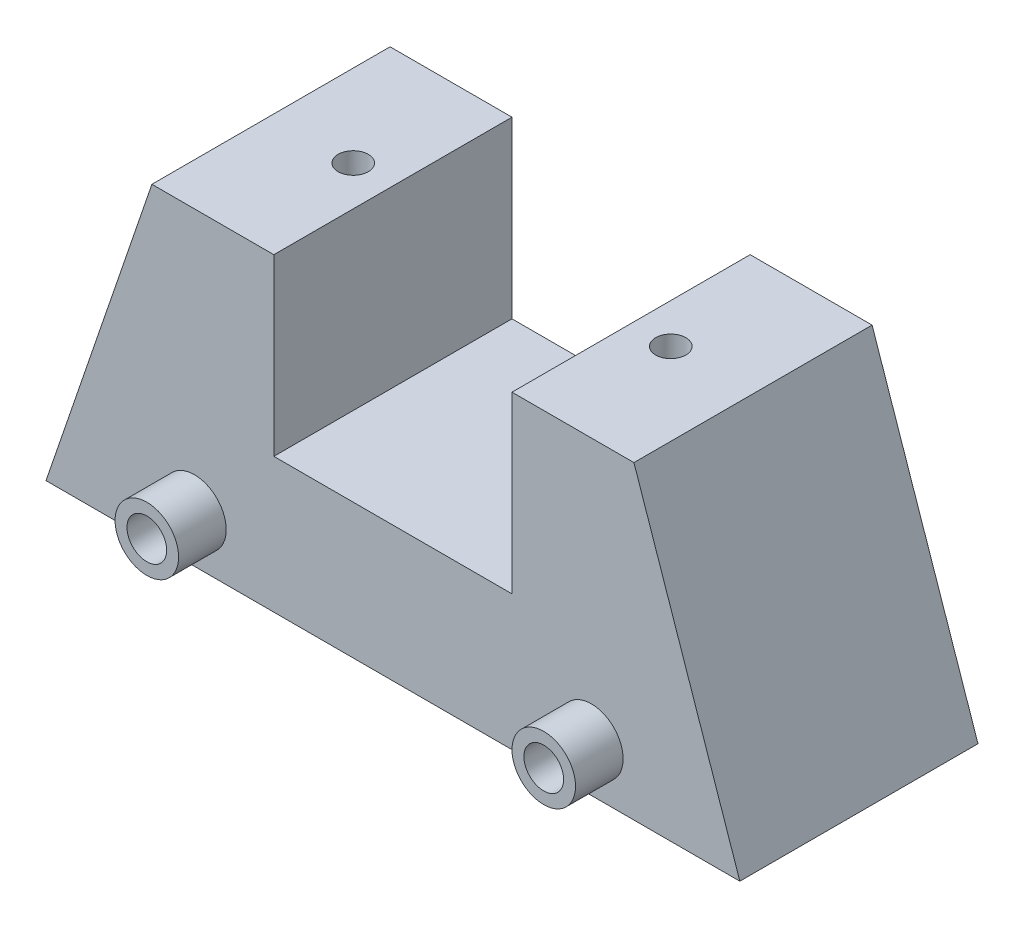
ISO-10303-21;
HEADER;
FILE_DESCRIPTION(('STEP AP214'),'2;1');
FILE_NAME('part.step','',(''),(''),'','','');
FILE_SCHEMA(('AUTOMOTIVE_DESIGN { 1 0 10303 214 1 1 1 1 }'));
ENDSEC;
DATA;
#1=APPLICATION_CONTEXT('core data for automotive mechanical design processes');
#2=APPLICATION_PROTOCOL_DEFINITION('international standard','automotive_design',2000,#1);
#3=PRODUCT_CONTEXT('',#1,'mechanical');
#4=PRODUCT('Part','Part','',(#3));
#5=PRODUCT_RELATED_PRODUCT_CATEGORY('part','',(#4));
#6=PRODUCT_DEFINITION_FORMATION('','',#4);
#7=PRODUCT_DEFINITION_CONTEXT('part definition',#1,'design');
#8=PRODUCT_DEFINITION('design','',#6,#7);
#9=PRODUCT_DEFINITION_SHAPE('','',#8);
#10=(LENGTH_UNIT() NAMED_UNIT(*) SI_UNIT(.MILLI.,.METRE.));
#11=(NAMED_UNIT(*) PLANE_ANGLE_UNIT() SI_UNIT($,.RADIAN.));
#12=(NAMED_UNIT(*) SI_UNIT($,.STERADIAN.) SOLID_ANGLE_UNIT());
#13=UNCERTAINTY_MEASURE_WITH_UNIT(LENGTH_MEASURE(1.E-05),#10,'distance_accuracy_value','');
#14=(GEOMETRIC_REPRESENTATION_CONTEXT(3) GLOBAL_UNCERTAINTY_ASSIGNED_CONTEXT((#13)) GLOBAL_UNIT_ASSIGNED_CONTEXT((#10,
#11,#12)) REPRESENTATION_CONTEXT('',''));
#15=CARTESIAN_POINT('',(0.,0.,0.));
#16=DIRECTION('',(0.,0.,1.));
#17=DIRECTION('',(1.,0.,0.));
#18=AXIS2_PLACEMENT_3D('',#15,#16,#17);
#19=CARTESIAN_POINT('',(-43.7,39.,30.));
#20=DIRECTION('',(0.,-1.,0.));
#21=DIRECTION('',(1.,0.,0.));
#22=AXIS2_PLACEMENT_3D('',#19,#20,#21);
#23=PLANE('',#22);
#24=CARTESIAN_POINT('',(20.,39.,15.));
#25=DIRECTION('',(0.,1.,0.));
#26=DIRECTION('',(-1.,0.,0.));
#27=AXIS2_PLACEMENT_3D('',#24,#25,#26);
#28=CIRCLE('',#27,1.9);
#29=CARTESIAN_POINT('',(18.1,39.,15.));
#30=VERTEX_POINT('',#29);
#31=EDGE_CURVE('E298',#30,#30,#28,.T.);
#32=ORIENTED_EDGE('',*,*,#31,.F.);
#33=EDGE_LOOP('',(#32));
#34=FACE_BOUND('',#33,.T.);
#35=DIRECTION('',(-1.,0.,0.));
#36=VECTOR('',#35,1.);
#37=CARTESIAN_POINT('',(-43.7,39.,0.));
#38=LINE('',#37,#36);
#39=CARTESIAN_POINT('',(30.3587215046538,39.,0.));
#40=VERTEX_POINT('',#39);
#41=CARTESIAN_POINT('',(15.,39.,0.));
#42=VERTEX_POINT('',#41);
#43=EDGE_CURVE('E176',#40,#42,#38,.T.);
#44=ORIENTED_EDGE('',*,*,#43,.T.);
#45=DIRECTION('',(0.,0.,1.));
#46=VECTOR('',#45,1.);
#47=CARTESIAN_POINT('',(15.,39.,0.));
#48=LINE('',#47,#46);
#49=CARTESIAN_POINT('',(15.,39.,30.));
#50=VERTEX_POINT('',#49);
#51=EDGE_CURVE('E271',#42,#50,#48,.T.);
#52=ORIENTED_EDGE('',*,*,#51,.T.);
#53=DIRECTION('',(-1.,0.,0.));
#54=VECTOR('',#53,1.);
#55=CARTESIAN_POINT('',(-43.7,39.,30.));
#56=LINE('',#55,#54);
#57=CARTESIAN_POINT('',(30.3587215046538,39.,30.));
#58=VERTEX_POINT('',#57);
#59=EDGE_CURVE('E172',#58,#50,#56,.T.);
#60=ORIENTED_EDGE('',*,*,#59,.F.);
#61=DIRECTION('',(0.,0.,1.));
#62=VECTOR('',#61,1.);
#63=CARTESIAN_POINT('',(30.3587215046538,39.,0.));
#64=LINE('',#63,#62);
#65=EDGE_CURVE('E251',#40,#58,#64,.T.);
#66=ORIENTED_EDGE('',*,*,#65,.F.);
#67=EDGE_LOOP('',(#44,#52,#60,#66));
#68=FACE_BOUND('',#67,.T.);
#69=ADVANCED_FACE('F39',(#34,#68),#23,.F.);
#70=CARTESIAN_POINT('',(-43.7,0.,30.));
#71=DIRECTION('',(0.,1.,0.));
#72=DIRECTION('',(-1.,0.,0.));
#73=AXIS2_PLACEMENT_3D('',#70,#71,#72);
#74=PLANE('',#73);
#75=DIRECTION('',(1.,0.,0.));
#76=VECTOR('',#75,1.);
#77=CARTESIAN_POINT('',(-43.7,0.,0.));
#78=LINE('',#77,#76);
#79=CARTESIAN_POINT('',(-43.7,0.,0.));
#80=VERTEX_POINT('',#79);
#81=CARTESIAN_POINT('',(43.7,0.,0.));
#82=VERTEX_POINT('',#81);
#83=EDGE_CURVE('E152',#80,#82,#78,.T.);
#84=ORIENTED_EDGE('',*,*,#83,.T.);
#85=DIRECTION('',(0.,0.,-1.));
#86=VECTOR('',#85,1.);
#87=CARTESIAN_POINT('',(43.7,0.,30.));
#88=LINE('',#87,#86);
#89=CARTESIAN_POINT('',(43.7,0.,30.));
#90=VERTEX_POINT('',#89);
#91=EDGE_CURVE('E167',#90,#82,#88,.T.);
#92=ORIENTED_EDGE('',*,*,#91,.F.);
#93=DIRECTION('',(1.,0.,0.));
#94=VECTOR('',#93,1.);
#95=CARTESIAN_POINT('',(-43.7,0.,30.));
#96=LINE('',#95,#94);
#97=CARTESIAN_POINT('',(-43.7,0.,30.));
#98=VERTEX_POINT('',#97);
#99=EDGE_CURVE('E165',#98,#90,#96,.T.);
#100=ORIENTED_EDGE('',*,*,#99,.F.);
#101=DIRECTION('',(0.,0.,-1.));
#102=VECTOR('',#101,1.);
#103=CARTESIAN_POINT('',(-43.7,0.,30.));
#104=LINE('',#103,#102);
#105=EDGE_CURVE('E142',#98,#80,#104,.T.);
#106=ORIENTED_EDGE('',*,*,#105,.T.);
#107=EDGE_LOOP('',(#84,#92,#100,#106));
#108=FACE_BOUND('',#107,.T.);
#109=DIRECTION('',(1.,0.,0.));
#110=VECTOR('',#109,1.);
#111=CARTESIAN_POINT('',(-38.6679002644307,0.,4.));
#112=LINE('',#111,#110);
#113=CARTESIAN_POINT('',(-38.6679002644307,0.,4.));
#114=VERTEX_POINT('',#113);
#115=CARTESIAN_POINT('',(38.6679002644307,0.,4.));
#116=VERTEX_POINT('',#115);
#117=EDGE_CURVE('E244',#114,#116,#112,.T.);
#118=ORIENTED_EDGE('',*,*,#117,.F.);
#119=DIRECTION('',(0.,0.,1.));
#120=VECTOR('',#119,1.);
#121=CARTESIAN_POINT('',(-38.6679002644307,0.,4.));
#122=LINE('',#121,#120);
#123=CARTESIAN_POINT('',(-38.6679002644307,0.,26.));
#124=VERTEX_POINT('',#123);
#125=EDGE_CURVE('E184',#114,#124,#122,.T.);
#126=ORIENTED_EDGE('',*,*,#125,.T.);
#127=DIRECTION('',(1.,0.,0.));
#128=VECTOR('',#127,1.);
#129=CARTESIAN_POINT('',(-38.6679002644307,0.,26.));
#130=LINE('',#129,#128);
#131=CARTESIAN_POINT('',(38.6679002644307,0.,26.));
#132=VERTEX_POINT('',#131);
#133=EDGE_CURVE('E221',#124,#132,#130,.T.);
#134=ORIENTED_EDGE('',*,*,#133,.T.);
#135=DIRECTION('',(0.,0.,1.));
#136=VECTOR('',#135,1.);
#137=CARTESIAN_POINT('',(38.6679002644307,0.,4.));
#138=LINE('',#137,#136);
#139=EDGE_CURVE('E188',#116,#132,#138,.T.);
#140=ORIENTED_EDGE('',*,*,#139,.F.);
#141=EDGE_LOOP('',(#118,#126,#134,#140));
#142=FACE_BOUND('',#141,.T.);
#143=ADVANCED_FACE('F41',(#108,#142),#74,.F.);
#144=CARTESIAN_POINT('',(-20.,39.,15.));
#145=DIRECTION('',(0.,1.,0.));
#146=DIRECTION('',(-1.,0.,0.));
#147=AXIS2_PLACEMENT_3D('',#144,#145,#146);
#148=CIRCLE('',#147,1.9);
#149=CARTESIAN_POINT('',(-21.9,39.,15.));
#150=VERTEX_POINT('',#149);
#151=EDGE_CURVE('E307',#150,#150,#148,.T.);
#152=ORIENTED_EDGE('',*,*,#151,.F.);
#153=EDGE_LOOP('',(#152));
#154=FACE_BOUND('',#153,.T.);
#155=CARTESIAN_POINT('',(-15.,39.,0.));
#156=VERTEX_POINT('',#155);
#157=CARTESIAN_POINT('',(-30.3587215046538,39.,0.));
#158=VERTEX_POINT('',#157);
#159=EDGE_CURVE('E159',#156,#158,#38,.T.);
#160=ORIENTED_EDGE('',*,*,#159,.T.);
#161=DIRECTION('',(0.,0.,1.));
#162=VECTOR('',#161,1.);
#163=CARTESIAN_POINT('',(-30.3587215046538,39.,0.));
#164=LINE('',#163,#162);
#165=CARTESIAN_POINT('',(-30.3587215046538,39.,30.));
#166=VERTEX_POINT('',#165);
#167=EDGE_CURVE('E63',#158,#166,#164,.T.);
#168=ORIENTED_EDGE('',*,*,#167,.T.);
#169=CARTESIAN_POINT('',(-15.,39.,30.));
#170=VERTEX_POINT('',#169);
#171=EDGE_CURVE('E178',#170,#166,#56,.T.);
#172=ORIENTED_EDGE('',*,*,#171,.F.);
#173=DIRECTION('',(0.,0.,1.));
#174=VECTOR('',#173,1.);
#175=CARTESIAN_POINT('',(-15.,39.,0.));
#176=LINE('',#175,#174);
#177=EDGE_CURVE('E261',#156,#170,#176,.T.);
#178=ORIENTED_EDGE('',*,*,#177,.F.);
#179=EDGE_LOOP('',(#160,#168,#172,#178));
#180=FACE_BOUND('',#179,.T.);
#181=ADVANCED_FACE('F357',(#154,#180),#23,.F.);
#182=CARTESIAN_POINT('',(0.,0.,30.));
#183=DIRECTION('',(0.,0.,-1.));
#184=DIRECTION('',(-1.,0.,0.));
#185=AXIS2_PLACEMENT_3D('',#182,#183,#184);
#186=PLANE('',#185);
#187=CARTESIAN_POINT('',(-25.,6.,30.));
#188=DIRECTION('',(0.,0.,-1.));
#189=DIRECTION('',(-1.,0.,0.));
#190=AXIS2_PLACEMENT_3D('',#187,#188,#189);
#191=CIRCLE('',#190,4.);
#192=CARTESIAN_POINT('',(-29.,6.,30.));
#193=VERTEX_POINT('',#192);
#194=EDGE_CURVE('E11',#193,#193,#191,.F.);
#195=ORIENTED_EDGE('',*,*,#194,.F.);
#196=EDGE_LOOP('',(#195));
#197=FACE_BOUND('',#196,.T.);
#198=CARTESIAN_POINT('',(25.,6.,30.));
#199=DIRECTION('',(0.,0.,-1.));
#200=DIRECTION('',(-1.,0.,0.));
#201=AXIS2_PLACEMENT_3D('',#198,#199,#200);
#202=CIRCLE('',#201,4.);
#203=CARTESIAN_POINT('',(21.,6.,30.));
#204=VERTEX_POINT('',#203);
#205=EDGE_CURVE('E48',#204,#204,#202,.F.);
#206=ORIENTED_EDGE('',*,*,#205,.F.);
#207=EDGE_LOOP('',(#206));
#208=FACE_BOUND('',#207,.T.);
#209=ORIENTED_EDGE('',*,*,#171,.T.);
#210=DIRECTION('',(0.323669722532752,0.946170127786526,0.));
#211=VECTOR('',#210,1.);
#212=CARTESIAN_POINT('',(-43.7,0.,30.));
#213=LINE('',#212,#211);
#214=EDGE_CURVE('E148',#98,#166,#213,.T.);
#215=ORIENTED_EDGE('',*,*,#214,.F.);
#216=ORIENTED_EDGE('',*,*,#99,.T.);
#217=DIRECTION('',(0.323669722532752,-0.946170127786526,0.));
#218=VECTOR('',#217,1.);
#219=CARTESIAN_POINT('',(30.3587215046538,39.,30.));
#220=LINE('',#219,#218);
#221=EDGE_CURVE('E255',#58,#90,#220,.T.);
#222=ORIENTED_EDGE('',*,*,#221,.F.);
#223=ORIENTED_EDGE('',*,*,#59,.T.);
#224=DIRECTION('',(0.,1.,0.));
#225=VECTOR('',#224,1.);
#226=CARTESIAN_POINT('',(15.,17.,30.));
#227=LINE('',#226,#225);
#228=CARTESIAN_POINT('',(15.,17.,30.));
#229=VERTEX_POINT('',#228);
#230=EDGE_CURVE('E275',#229,#50,#227,.T.);
#231=ORIENTED_EDGE('',*,*,#230,.F.);
#232=DIRECTION('',(1.,0.,0.));
#233=VECTOR('',#232,1.);
#234=CARTESIAN_POINT('',(-15.,17.,30.));
#235=LINE('',#234,#233);
#236=CARTESIAN_POINT('',(-15.,17.,30.));
#237=VERTEX_POINT('',#236);
#238=EDGE_CURVE('E279',#237,#229,#235,.T.);
#239=ORIENTED_EDGE('',*,*,#238,.F.);
#240=DIRECTION('',(0.,-1.,0.));
#241=VECTOR('',#240,1.);
#242=CARTESIAN_POINT('',(-15.,39.,30.));
#243=LINE('',#242,#241);
#244=EDGE_CURVE('E254',#170,#237,#243,.T.);
#245=ORIENTED_EDGE('',*,*,#244,.F.);
#246=EDGE_LOOP('',(#209,#215,#216,#222,#223,#231,#239,#245));
#247=FACE_BOUND('',#246,.T.);
#248=ADVANCED_FACE('F354',(#197,#208,#247),#186,.F.);
#249=CARTESIAN_POINT('',(0.,0.,0.));
#250=DIRECTION('',(0.,0.,-1.));
#251=DIRECTION('',(-1.,0.,0.));
#252=AXIS2_PLACEMENT_3D('',#249,#250,#251);
#253=PLANE('',#252);
#254=DIRECTION('',(0.323669722532752,0.946170127786526,0.));
#255=VECTOR('',#254,1.);
#256=CARTESIAN_POINT('',(-43.7,0.,0.));
#257=LINE('',#256,#255);
#258=EDGE_CURVE('E138',#80,#158,#257,.T.);
#259=ORIENTED_EDGE('',*,*,#258,.T.);
#260=ORIENTED_EDGE('',*,*,#159,.F.);
#261=DIRECTION('',(0.,-1.,0.));
#262=VECTOR('',#261,1.);
#263=CARTESIAN_POINT('',(-15.,39.,0.));
#264=LINE('',#263,#262);
#265=CARTESIAN_POINT('',(-15.,17.,0.));
#266=VERTEX_POINT('',#265);
#267=EDGE_CURVE('E278',#156,#266,#264,.T.);
#268=ORIENTED_EDGE('',*,*,#267,.T.);
#269=DIRECTION('',(1.,0.,0.));
#270=VECTOR('',#269,1.);
#271=CARTESIAN_POINT('',(-15.,17.,0.));
#272=LINE('',#271,#270);
#273=CARTESIAN_POINT('',(15.,17.,0.));
#274=VERTEX_POINT('',#273);
#275=EDGE_CURVE('E55',#266,#274,#272,.T.);
#276=ORIENTED_EDGE('',*,*,#275,.T.);
#277=DIRECTION('',(0.,1.,0.));
#278=VECTOR('',#277,1.);
#279=CARTESIAN_POINT('',(15.,17.,0.));
#280=LINE('',#279,#278);
#281=EDGE_CURVE('E265',#274,#42,#280,.T.);
#282=ORIENTED_EDGE('',*,*,#281,.T.);
#283=ORIENTED_EDGE('',*,*,#43,.F.);
#284=DIRECTION('',(0.323669722532752,-0.946170127786526,0.));
#285=VECTOR('',#284,1.);
#286=CARTESIAN_POINT('',(30.3587215046538,39.,0.));
#287=LINE('',#286,#285);
#288=EDGE_CURVE('E155',#40,#82,#287,.T.);
#289=ORIENTED_EDGE('',*,*,#288,.T.);
#290=ORIENTED_EDGE('',*,*,#83,.F.);
#291=EDGE_LOOP('',(#259,#260,#268,#276,#282,#283,#289,#290));
#292=FACE_BOUND('',#291,.T.);
#293=ADVANCED_FACE('F153',(#292),#253,.T.);
#294=CARTESIAN_POINT('',(-37.1078714056518,4.56036694786034,4.));
#295=DIRECTION('',(-0.946170127786527,0.323669722532749,0.));
#296=DIRECTION('',(-0.323669722532749,-0.946170127786527,0.));
#297=AXIS2_PLACEMENT_3D('',#294,#295,#296);
#298=PLANE('',#297);
#299=DIRECTION('',(-0.323669722532749,-0.946170127786527,0.));
#300=VECTOR('',#299,1.);
#301=CARTESIAN_POINT('',(-37.1078714056518,4.56036694786034,26.));
#302=LINE('',#301,#300);
#303=CARTESIAN_POINT('',(-37.1078714056518,4.56036694786033,26.));
#304=VERTEX_POINT('',#303);
#305=EDGE_CURVE('E225',#304,#124,#302,.T.);
#306=ORIENTED_EDGE('',*,*,#305,.T.);
#307=ORIENTED_EDGE('',*,*,#125,.F.);
#308=DIRECTION('',(-0.323669722532749,-0.946170127786527,0.));
#309=VECTOR('',#308,1.);
#310=CARTESIAN_POINT('',(-37.1078714056518,4.56036694786034,4.));
#311=LINE('',#310,#309);
#312=CARTESIAN_POINT('',(-37.1078714056518,4.56036694786033,4.));
#313=VERTEX_POINT('',#312);
#314=EDGE_CURVE('E208',#313,#114,#311,.T.);
#315=ORIENTED_EDGE('',*,*,#314,.F.);
#316=DIRECTION('',(0.,0.,1.));
#317=VECTOR('',#316,1.);
#318=CARTESIAN_POINT('',(-37.1078714056518,4.56036694786033,4.));
#319=LINE('',#318,#317);
#320=EDGE_CURVE('E160',#313,#304,#319,.T.);
#321=ORIENTED_EDGE('',*,*,#320,.T.);
#322=EDGE_LOOP('',(#306,#307,#315,#321));
#323=FACE_BOUND('',#322,.T.);
#324=ADVANCED_FACE('F563',(#323),#298,.F.);
#325=CARTESIAN_POINT('',(-26.7,1.00000000000003,4.));
#326=DIRECTION('',(0.,0.,1.));
#327=DIRECTION('',(1.,0.,0.));
#328=AXIS2_PLACEMENT_3D('',#325,#326,#327);
#329=CYLINDRICAL_SURFACE('',#328,11.);
#330=CARTESIAN_POINT('',(-26.7,1.00000000000003,26.));
#331=DIRECTION('',(0.,0.,1.));
#332=DIRECTION('',(1.,0.,0.));
#333=AXIS2_PLACEMENT_3D('',#330,#331,#332);
#334=CIRCLE('',#333,11.);
#335=CARTESIAN_POINT('',(-26.7,12.,26.));
#336=VERTEX_POINT('',#335);
#337=EDGE_CURVE('E204',#336,#304,#334,.T.);
#338=ORIENTED_EDGE('',*,*,#337,.T.);
#339=ORIENTED_EDGE('',*,*,#320,.F.);
#340=CARTESIAN_POINT('',(-26.7,1.00000000000003,4.));
#341=DIRECTION('',(0.,0.,1.));
#342=DIRECTION('',(1.,0.,0.));
#343=AXIS2_PLACEMENT_3D('',#340,#341,#342);
#344=CIRCLE('',#343,11.);
#345=CARTESIAN_POINT('',(-26.7,12.,4.));
#346=VERTEX_POINT('',#345);
#347=EDGE_CURVE('E189',#346,#313,#344,.T.);
#348=ORIENTED_EDGE('',*,*,#347,.F.);
#349=DIRECTION('',(0.,0.,1.));
#350=VECTOR('',#349,1.);
#351=CARTESIAN_POINT('',(-26.7,12.,4.));
#352=LINE('',#351,#350);
#353=EDGE_CURVE('E199',#346,#336,#352,.T.);
#354=ORIENTED_EDGE('',*,*,#353,.T.);
#355=EDGE_LOOP('',(#338,#339,#348,#354));
#356=FACE_BOUND('',#355,.T.);
#357=ADVANCED_FACE('F549',(#356),#329,.F.);
#358=CARTESIAN_POINT('',(26.7,12.,4.));
#359=DIRECTION('',(0.,1.,0.));
#360=DIRECTION('',(0.,0.,1.));
#361=AXIS2_PLACEMENT_3D('',#358,#359,#360);
#362=PLANE('',#361);
#363=DIRECTION('',(-1.,0.,0.));
#364=VECTOR('',#363,1.);
#365=CARTESIAN_POINT('',(26.7,12.,26.));
#366=LINE('',#365,#364);
#367=CARTESIAN_POINT('',(26.7,12.,26.));
#368=VERTEX_POINT('',#367);
#369=EDGE_CURVE('E209',#368,#336,#366,.T.);
#370=ORIENTED_EDGE('',*,*,#369,.T.);
#371=ORIENTED_EDGE('',*,*,#353,.F.);
#372=DIRECTION('',(-1.,0.,0.));
#373=VECTOR('',#372,1.);
#374=CARTESIAN_POINT('',(26.7,12.,4.));
#375=LINE('',#374,#373);
#376=CARTESIAN_POINT('',(26.7,12.,4.));
#377=VERTEX_POINT('',#376);
#378=EDGE_CURVE('E232',#377,#346,#375,.T.);
#379=ORIENTED_EDGE('',*,*,#378,.F.);
#380=DIRECTION('',(0.,0.,1.));
#381=VECTOR('',#380,1.);
#382=CARTESIAN_POINT('',(26.7,12.,4.));
#383=LINE('',#382,#381);
#384=EDGE_CURVE('E196',#377,#368,#383,.T.);
#385=ORIENTED_EDGE('',*,*,#384,.T.);
#386=EDGE_LOOP('',(#370,#371,#379,#385));
#387=FACE_BOUND('',#386,.T.);
#388=ADVANCED_FACE('F554',(#387),#362,.F.);
#389=CARTESIAN_POINT('',(26.7,1.00000000000003,4.));
#390=DIRECTION('',(0.,0.,1.));
#391=DIRECTION('',(1.,0.,0.));
#392=AXIS2_PLACEMENT_3D('',#389,#390,#391);
#393=CYLINDRICAL_SURFACE('',#392,11.);
#394=CARTESIAN_POINT('',(26.7,1.00000000000003,26.));
#395=DIRECTION('',(0.,0.,1.));
#396=DIRECTION('',(1.,0.,0.));
#397=AXIS2_PLACEMENT_3D('',#394,#395,#396);
#398=CIRCLE('',#397,11.);
#399=CARTESIAN_POINT('',(37.1078714056518,4.56036694786034,26.));
#400=VERTEX_POINT('',#399);
#401=EDGE_CURVE('E213',#400,#368,#398,.T.);
#402=ORIENTED_EDGE('',*,*,#401,.T.);
#403=ORIENTED_EDGE('',*,*,#384,.F.);
#404=CARTESIAN_POINT('',(26.7,1.00000000000003,4.));
#405=DIRECTION('',(0.,0.,1.));
#406=DIRECTION('',(1.,0.,0.));
#407=AXIS2_PLACEMENT_3D('',#404,#405,#406);
#408=CIRCLE('',#407,11.);
#409=CARTESIAN_POINT('',(37.1078714056518,4.56036694786034,4.));
#410=VERTEX_POINT('',#409);
#411=EDGE_CURVE('E236',#410,#377,#408,.T.);
#412=ORIENTED_EDGE('',*,*,#411,.F.);
#413=DIRECTION('',(0.,0.,1.));
#414=VECTOR('',#413,1.);
#415=CARTESIAN_POINT('',(37.1078714056518,4.56036694786034,4.));
#416=LINE('',#415,#414);
#417=EDGE_CURVE('E193',#410,#400,#416,.T.);
#418=ORIENTED_EDGE('',*,*,#417,.T.);
#419=EDGE_LOOP('',(#402,#403,#412,#418));
#420=FACE_BOUND('',#419,.T.);
#421=ADVANCED_FACE('F557',(#420),#393,.F.);
#422=CARTESIAN_POINT('',(38.6679002644307,0.,4.));
#423=DIRECTION('',(0.946170127786526,0.323669722532751,0.));
#424=DIRECTION('',(-0.323669722532751,0.946170127786526,0.));
#425=AXIS2_PLACEMENT_3D('',#422,#423,#424);
#426=PLANE('',#425);
#427=DIRECTION('',(-0.323669722532751,0.946170127786526,0.));
#428=VECTOR('',#427,1.);
#429=CARTESIAN_POINT('',(38.6679002644307,0.,26.));
#430=LINE('',#429,#428);
#431=EDGE_CURVE('E217',#132,#400,#430,.T.);
#432=ORIENTED_EDGE('',*,*,#431,.T.);
#433=ORIENTED_EDGE('',*,*,#417,.F.);
#434=DIRECTION('',(-0.323669722532751,0.946170127786526,0.));
#435=VECTOR('',#434,1.);
#436=CARTESIAN_POINT('',(38.6679002644307,0.,4.));
#437=LINE('',#436,#435);
#438=EDGE_CURVE('E240',#116,#410,#437,.T.);
#439=ORIENTED_EDGE('',*,*,#438,.F.);
#440=ORIENTED_EDGE('',*,*,#139,.T.);
#441=EDGE_LOOP('',(#432,#433,#439,#440));
#442=FACE_BOUND('',#441,.T.);
#443=ADVANCED_FACE('F560',(#442),#426,.F.);
#444=CARTESIAN_POINT('',(26.7,1.00000000000003,4.));
#445=DIRECTION('',(0.,0.,1.));
#446=DIRECTION('',(1.,0.,0.));
#447=AXIS2_PLACEMENT_3D('',#444,#445,#446);
#448=PLANE('',#447);
#449=ORIENTED_EDGE('',*,*,#314,.T.);
#450=ORIENTED_EDGE('',*,*,#117,.T.);
#451=ORIENTED_EDGE('',*,*,#438,.T.);
#452=ORIENTED_EDGE('',*,*,#411,.T.);
#453=ORIENTED_EDGE('',*,*,#378,.T.);
#454=ORIENTED_EDGE('',*,*,#347,.T.);
#455=EDGE_LOOP('',(#449,#450,#451,#452,#453,#454));
#456=FACE_BOUND('',#455,.T.);
#457=ADVANCED_FACE('F390',(#456),#448,.T.);
#458=CARTESIAN_POINT('',(26.7,1.00000000000003,26.));
#459=DIRECTION('',(0.,0.,1.));
#460=DIRECTION('',(1.,0.,0.));
#461=AXIS2_PLACEMENT_3D('',#458,#459,#460);
#462=PLANE('',#461);
#463=CARTESIAN_POINT('',(25.,6.,26.));
#464=DIRECTION('',(0.,0.,1.));
#465=DIRECTION('',(1.,0.,0.));
#466=AXIS2_PLACEMENT_3D('',#463,#464,#465);
#467=CIRCLE('',#466,2.5);
#468=CARTESIAN_POINT('',(27.5,6.,26.));
#469=VERTEX_POINT('',#468);
#470=EDGE_CURVE('E321',#469,#469,#467,.F.);
#471=ORIENTED_EDGE('',*,*,#470,.F.);
#472=EDGE_LOOP('',(#471));
#473=FACE_BOUND('',#472,.T.);
#474=CARTESIAN_POINT('',(-25.,6.,26.));
#475=DIRECTION('',(0.,0.,1.));
#476=DIRECTION('',(1.,0.,0.));
#477=AXIS2_PLACEMENT_3D('',#474,#475,#476);
#478=CIRCLE('',#477,2.5);
#479=CARTESIAN_POINT('',(-22.5,6.,26.));
#480=VERTEX_POINT('',#479);
#481=EDGE_CURVE('E322',#480,#480,#478,.F.);
#482=ORIENTED_EDGE('',*,*,#481,.F.);
#483=EDGE_LOOP('',(#482));
#484=FACE_BOUND('',#483,.T.);
#485=ORIENTED_EDGE('',*,*,#305,.F.);
#486=ORIENTED_EDGE('',*,*,#337,.F.);
#487=ORIENTED_EDGE('',*,*,#369,.F.);
#488=ORIENTED_EDGE('',*,*,#401,.F.);
#489=ORIENTED_EDGE('',*,*,#431,.F.);
#490=ORIENTED_EDGE('',*,*,#133,.F.);
#491=EDGE_LOOP('',(#485,#486,#487,#488,#489,#490));
#492=FACE_BOUND('',#491,.T.);
#493=ADVANCED_FACE('F383',(#473,#484,#492),#462,.F.);
#494=CARTESIAN_POINT('',(30.3587215046538,39.,0.));
#495=DIRECTION('',(-0.946170127786526,-0.323669722532752,0.));
#496=DIRECTION('',(0.323669722532752,-0.946170127786526,0.));
#497=AXIS2_PLACEMENT_3D('',#494,#495,#496);
#498=PLANE('',#497);
#499=ORIENTED_EDGE('',*,*,#221,.T.);
#500=ORIENTED_EDGE('',*,*,#91,.T.);
#501=ORIENTED_EDGE('',*,*,#288,.F.);
#502=ORIENTED_EDGE('',*,*,#65,.T.);
#503=EDGE_LOOP('',(#499,#500,#501,#502));
#504=FACE_BOUND('',#503,.T.);
#505=ADVANCED_FACE('F381',(#504),#498,.F.);
#506=CARTESIAN_POINT('',(15.,17.,0.));
#507=DIRECTION('',(1.,0.,0.));
#508=DIRECTION('',(0.,1.,0.));
#509=AXIS2_PLACEMENT_3D('',#506,#507,#508);
#510=PLANE('',#509);
#511=ORIENTED_EDGE('',*,*,#230,.T.);
#512=ORIENTED_EDGE('',*,*,#51,.F.);
#513=ORIENTED_EDGE('',*,*,#281,.F.);
#514=DIRECTION('',(0.,0.,1.));
#515=VECTOR('',#514,1.);
#516=CARTESIAN_POINT('',(15.,17.,0.));
#517=LINE('',#516,#515);
#518=EDGE_CURVE('E268',#274,#229,#517,.T.);
#519=ORIENTED_EDGE('',*,*,#518,.T.);
#520=EDGE_LOOP('',(#511,#512,#513,#519));
#521=FACE_BOUND('',#520,.T.);
#522=ADVANCED_FACE('F374',(#521),#510,.F.);
#523=CARTESIAN_POINT('',(-15.,17.,0.));
#524=DIRECTION('',(0.,-1.,0.));
#525=DIRECTION('',(0.,0.,-1.));
#526=AXIS2_PLACEMENT_3D('',#523,#524,#525);
#527=PLANE('',#526);
#528=ORIENTED_EDGE('',*,*,#238,.T.);
#529=ORIENTED_EDGE('',*,*,#518,.F.);
#530=ORIENTED_EDGE('',*,*,#275,.F.);
#531=DIRECTION('',(0.,0.,1.));
#532=VECTOR('',#531,1.);
#533=CARTESIAN_POINT('',(-15.,17.,0.));
#534=LINE('',#533,#532);
#535=EDGE_CURVE('E264',#266,#237,#534,.T.);
#536=ORIENTED_EDGE('',*,*,#535,.T.);
#537=EDGE_LOOP('',(#528,#529,#530,#536));
#538=FACE_BOUND('',#537,.T.);
#539=ADVANCED_FACE('F367',(#538),#527,.F.);
#540=CARTESIAN_POINT('',(-15.,39.,0.));
#541=DIRECTION('',(-1.,0.,0.));
#542=DIRECTION('',(0.,-1.,0.));
#543=AXIS2_PLACEMENT_3D('',#540,#541,#542);
#544=PLANE('',#543);
#545=ORIENTED_EDGE('',*,*,#244,.T.);
#546=ORIENTED_EDGE('',*,*,#535,.F.);
#547=ORIENTED_EDGE('',*,*,#267,.F.);
#548=ORIENTED_EDGE('',*,*,#177,.T.);
#549=EDGE_LOOP('',(#545,#546,#547,#548));
#550=FACE_BOUND('',#549,.T.);
#551=ADVANCED_FACE('F366',(#550),#544,.F.);
#552=CARTESIAN_POINT('',(-43.7,0.,0.));
#553=DIRECTION('',(0.946170127786526,-0.323669722532752,0.));
#554=DIRECTION('',(0.323669722532752,0.946170127786526,0.));
#555=AXIS2_PLACEMENT_3D('',#552,#553,#554);
#556=PLANE('',#555);
#557=ORIENTED_EDGE('',*,*,#214,.T.);
#558=ORIENTED_EDGE('',*,*,#167,.F.);
#559=ORIENTED_EDGE('',*,*,#258,.F.);
#560=ORIENTED_EDGE('',*,*,#105,.F.);
#561=EDGE_LOOP('',(#557,#558,#559,#560));
#562=FACE_BOUND('',#561,.T.);
#563=ADVANCED_FACE('F140',(#562),#556,.F.);
#564=CARTESIAN_POINT('',(-20.,24.,15.));
#565=DIRECTION('',(0.,1.,0.));
#566=DIRECTION('',(-1.,0.,0.));
#567=AXIS2_PLACEMENT_3D('',#564,#565,#566);
#568=CYLINDRICAL_SURFACE('',#567,1.9);
#569=CARTESIAN_POINT('',(-20.,24.,15.));
#570=DIRECTION('',(0.,1.,0.));
#571=DIRECTION('',(-1.,0.,0.));
#572=AXIS2_PLACEMENT_3D('',#569,#570,#571);
#573=CIRCLE('',#572,1.9);
#574=CARTESIAN_POINT('',(-21.9,24.,15.));
#575=VERTEX_POINT('',#574);
#576=EDGE_CURVE('E258',#575,#575,#573,.T.);
#577=ORIENTED_EDGE('',*,*,#576,.F.);
#578=EDGE_LOOP('',(#577));
#579=FACE_BOUND('',#578,.T.);
#580=ORIENTED_EDGE('',*,*,#151,.T.);
#581=EDGE_LOOP('',(#580));
#582=FACE_BOUND('',#581,.T.);
#583=ADVANCED_FACE('F408',(#579,#582),#568,.F.);
#584=CARTESIAN_POINT('',(-20.,24.,15.));
#585=DIRECTION('',(0.,1.,0.));
#586=DIRECTION('',(-1.,0.,0.));
#587=AXIS2_PLACEMENT_3D('',#584,#585,#586);
#588=PLANE('',#587);
#589=ORIENTED_EDGE('',*,*,#576,.T.);
#590=EDGE_LOOP('',(#589));
#591=FACE_BOUND('',#590,.T.);
#592=ADVANCED_FACE('F410',(#591),#588,.T.);
#593=CARTESIAN_POINT('',(20.,24.,15.));
#594=DIRECTION('',(0.,1.,0.));
#595=DIRECTION('',(-1.,0.,0.));
#596=AXIS2_PLACEMENT_3D('',#593,#594,#595);
#597=CYLINDRICAL_SURFACE('',#596,1.9);
#598=CARTESIAN_POINT('',(20.,24.,15.));
#599=DIRECTION('',(0.,1.,0.));
#600=DIRECTION('',(-1.,0.,0.));
#601=AXIS2_PLACEMENT_3D('',#598,#599,#600);
#602=CIRCLE('',#601,1.9);
#603=CARTESIAN_POINT('',(18.1,24.,15.));
#604=VERTEX_POINT('',#603);
#605=EDGE_CURVE('E302',#604,#604,#602,.T.);
#606=ORIENTED_EDGE('',*,*,#605,.F.);
#607=EDGE_LOOP('',(#606));
#608=FACE_BOUND('',#607,.T.);
#609=ORIENTED_EDGE('',*,*,#31,.T.);
#610=EDGE_LOOP('',(#609));
#611=FACE_BOUND('',#610,.T.);
#612=ADVANCED_FACE('F417',(#608,#611),#597,.F.);
#613=CARTESIAN_POINT('',(20.,24.,15.));
#614=DIRECTION('',(0.,1.,0.));
#615=DIRECTION('',(-1.,0.,0.));
#616=AXIS2_PLACEMENT_3D('',#613,#614,#615);
#617=PLANE('',#616);
#618=ORIENTED_EDGE('',*,*,#605,.T.);
#619=EDGE_LOOP('',(#618));
#620=FACE_BOUND('',#619,.T.);
#621=ADVANCED_FACE('F350',(#620),#617,.T.);
#622=CARTESIAN_POINT('',(25.,6.,36.));
#623=DIRECTION('',(0.,0.,-1.));
#624=DIRECTION('',(-1.,0.,0.));
#625=AXIS2_PLACEMENT_3D('',#622,#623,#624);
#626=CYLINDRICAL_SURFACE('',#625,4.);
#627=CARTESIAN_POINT('',(25.,6.,36.));
#628=DIRECTION('',(0.,0.,1.));
#629=DIRECTION('',(1.,0.,0.));
#630=AXIS2_PLACEMENT_3D('',#627,#628,#629);
#631=CIRCLE('',#630,4.);
#632=CARTESIAN_POINT('',(29.,6.,36.));
#633=VERTEX_POINT('',#632);
#634=EDGE_CURVE('E303',#633,#633,#631,.T.);
#635=ORIENTED_EDGE('',*,*,#634,.F.);
#636=EDGE_LOOP('',(#635));
#637=FACE_BOUND('',#636,.T.);
#638=ORIENTED_EDGE('',*,*,#205,.T.);
#639=EDGE_LOOP('',(#638));
#640=FACE_BOUND('',#639,.T.);
#641=ADVANCED_FACE('F344',(#637,#640),#626,.T.);
#642=CARTESIAN_POINT('',(25.,6.,36.));
#643=DIRECTION('',(0.,0.,1.));
#644=DIRECTION('',(1.,0.,0.));
#645=AXIS2_PLACEMENT_3D('',#642,#643,#644);
#646=PLANE('',#645);
#647=CARTESIAN_POINT('',(25.,6.,36.));
#648=DIRECTION('',(0.,0.,1.));
#649=DIRECTION('',(1.,0.,0.));
#650=AXIS2_PLACEMENT_3D('',#647,#648,#649);
#651=CIRCLE('',#650,2.5);
#652=CARTESIAN_POINT('',(27.5,6.,36.));
#653=VERTEX_POINT('',#652);
#654=EDGE_CURVE('E326',#653,#653,#651,.T.);
#655=ORIENTED_EDGE('',*,*,#654,.F.);
#656=EDGE_LOOP('',(#655));
#657=FACE_BOUND('',#656,.T.);
#658=ORIENTED_EDGE('',*,*,#634,.T.);
#659=EDGE_LOOP('',(#658));
#660=FACE_BOUND('',#659,.T.);
#661=ADVANCED_FACE('F340',(#657,#660),#646,.T.);
#662=CARTESIAN_POINT('',(-25.,6.,36.));
#663=DIRECTION('',(0.,0.,-1.));
#664=DIRECTION('',(-1.,0.,0.));
#665=AXIS2_PLACEMENT_3D('',#662,#663,#664);
#666=CYLINDRICAL_SURFACE('',#665,4.);
#667=CARTESIAN_POINT('',(-25.,6.,36.));
#668=DIRECTION('',(0.,0.,1.));
#669=DIRECTION('',(1.,0.,0.));
#670=AXIS2_PLACEMENT_3D('',#667,#668,#669);
#671=CIRCLE('',#670,4.);
#672=CARTESIAN_POINT('',(-21.,6.,36.));
#673=VERTEX_POINT('',#672);
#674=EDGE_CURVE('E317',#673,#673,#671,.T.);
#675=ORIENTED_EDGE('',*,*,#674,.F.);
#676=EDGE_LOOP('',(#675));
#677=FACE_BOUND('',#676,.T.);
#678=ORIENTED_EDGE('',*,*,#194,.T.);
#679=EDGE_LOOP('',(#678));
#680=FACE_BOUND('',#679,.T.);
#681=ADVANCED_FACE('F343',(#677,#680),#666,.T.);
#682=CARTESIAN_POINT('',(-25.,6.,36.));
#683=DIRECTION('',(0.,0.,1.));
#684=DIRECTION('',(1.,0.,0.));
#685=AXIS2_PLACEMENT_3D('',#682,#683,#684);
#686=PLANE('',#685);
#687=CARTESIAN_POINT('',(-25.,6.,36.));
#688=DIRECTION('',(0.,0.,1.));
#689=DIRECTION('',(1.,0.,0.));
#690=AXIS2_PLACEMENT_3D('',#687,#688,#689);
#691=CIRCLE('',#690,2.5);
#692=CARTESIAN_POINT('',(-22.5,6.,36.));
#693=VERTEX_POINT('',#692);
#694=EDGE_CURVE('E327',#693,#693,#691,.T.);
#695=ORIENTED_EDGE('',*,*,#694,.F.);
#696=EDGE_LOOP('',(#695));
#697=FACE_BOUND('',#696,.T.);
#698=ORIENTED_EDGE('',*,*,#674,.T.);
#699=EDGE_LOOP('',(#698));
#700=FACE_BOUND('',#699,.T.);
#701=ADVANCED_FACE('F495',(#697,#700),#686,.T.);
#702=CARTESIAN_POINT('',(-25.,6.,18.9289321881345));
#703=DIRECTION('',(0.,0.,1.));
#704=DIRECTION('',(1.,0.,0.));
#705=AXIS2_PLACEMENT_3D('',#702,#703,#704);
#706=CYLINDRICAL_SURFACE('',#705,2.5);
#707=ORIENTED_EDGE('',*,*,#481,.T.);
#708=EDGE_LOOP('',(#707));
#709=FACE_BOUND('',#708,.T.);
#710=ORIENTED_EDGE('',*,*,#694,.T.);
#711=EDGE_LOOP('',(#710));
#712=FACE_BOUND('',#711,.T.);
#713=ADVANCED_FACE('F517',(#709,#712),#706,.F.);
#714=CARTESIAN_POINT('',(25.,6.,18.9289321881345));
#715=DIRECTION('',(0.,0.,1.));
#716=DIRECTION('',(1.,0.,0.));
#717=AXIS2_PLACEMENT_3D('',#714,#715,#716);
#718=CYLINDRICAL_SURFACE('',#717,2.5);
#719=ORIENTED_EDGE('',*,*,#470,.T.);
#720=EDGE_LOOP('',(#719));
#721=FACE_BOUND('',#720,.T.);
#722=ORIENTED_EDGE('',*,*,#654,.T.);
#723=EDGE_LOOP('',(#722));
#724=FACE_BOUND('',#723,.T.);
#725=ADVANCED_FACE('F338',(#721,#724),#718,.F.);
#726=CLOSED_SHELL('',(#69,#143,#181,#248,#293,#324,#357,#388,#421,#443,#457,#493,#505,#522,#539,
#551,#563,#583,#592,#612,#621,#641,#661,#681,#701,#713,#725));
#727=MANIFOLD_SOLID_BREP('B2',#726);
#728=ADVANCED_BREP_SHAPE_REPRESENTATION('',(#18,#727),#14);
#729=SHAPE_DEFINITION_REPRESENTATION(#9,#728);
ENDSEC;
END-ISO-10303-21;
